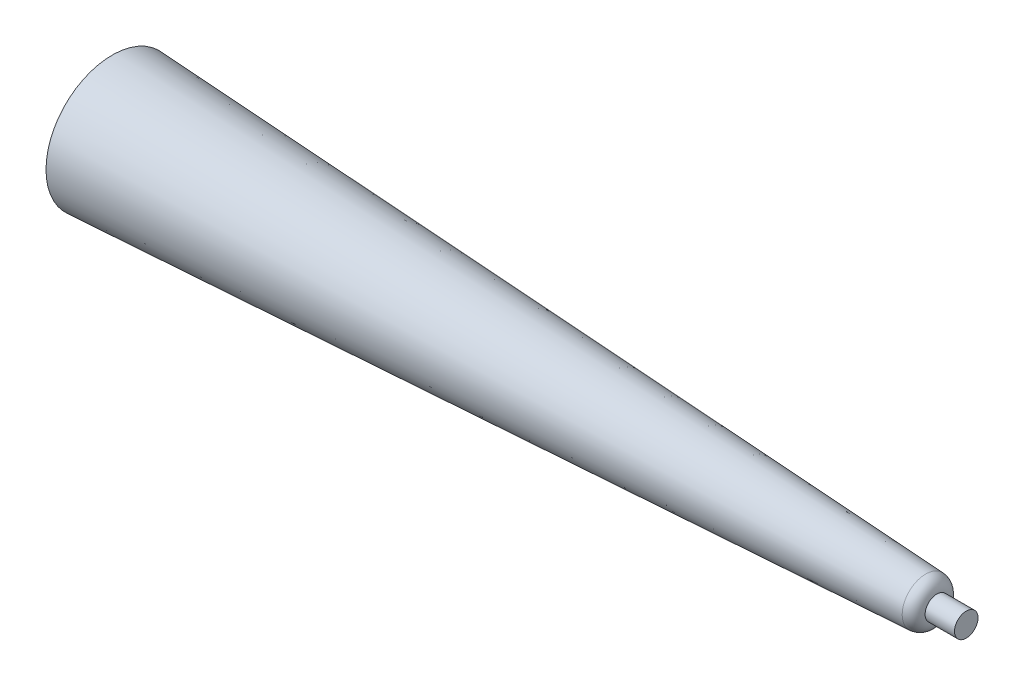
ISO-10303-21;
HEADER;
FILE_DESCRIPTION(('STEP AP214'),'2;1');
FILE_NAME('part.step','',(''),(''),'','','');
FILE_SCHEMA(('AUTOMOTIVE_DESIGN { 1 0 10303 214 1 1 1 1 }'));
ENDSEC;
DATA;
#1=APPLICATION_CONTEXT('core data for automotive mechanical design processes');
#2=APPLICATION_PROTOCOL_DEFINITION('international standard','automotive_design',2000,#1);
#3=PRODUCT_CONTEXT('',#1,'mechanical');
#4=PRODUCT('Part','Part','',(#3));
#5=PRODUCT_RELATED_PRODUCT_CATEGORY('part','',(#4));
#6=PRODUCT_DEFINITION_FORMATION('','',#4);
#7=PRODUCT_DEFINITION_CONTEXT('part definition',#1,'design');
#8=PRODUCT_DEFINITION('design','',#6,#7);
#9=PRODUCT_DEFINITION_SHAPE('','',#8);
#10=(LENGTH_UNIT() NAMED_UNIT(*) SI_UNIT(.MILLI.,.METRE.));
#11=(NAMED_UNIT(*) PLANE_ANGLE_UNIT() SI_UNIT($,.RADIAN.));
#12=(NAMED_UNIT(*) SI_UNIT($,.STERADIAN.) SOLID_ANGLE_UNIT());
#13=UNCERTAINTY_MEASURE_WITH_UNIT(LENGTH_MEASURE(1.E-05),#10,'distance_accuracy_value','');
#14=(GEOMETRIC_REPRESENTATION_CONTEXT(3) GLOBAL_UNCERTAINTY_ASSIGNED_CONTEXT((#13)) GLOBAL_UNIT_ASSIGNED_CONTEXT((#10,
#11,#12)) REPRESENTATION_CONTEXT('',''));
#15=CARTESIAN_POINT('',(0.,0.,0.));
#16=DIRECTION('',(0.,0.,1.));
#17=DIRECTION('',(1.,0.,0.));
#18=AXIS2_PLACEMENT_3D('',#15,#16,#17);
#19=CARTESIAN_POINT('',(-54.8672823597903,-3.28908892080457,0.));
#20=DIRECTION('',(1.,0.,0.));
#21=DIRECTION('',(0.,0.,-1.));
#22=AXIS2_PLACEMENT_3D('',#19,#20,#21);
#23=PLANE('',#22);
#24=CARTESIAN_POINT('',(-54.8672823597903,-6.14677677622485,0.));
#25=DIRECTION('',(-1.,0.,0.));
#26=DIRECTION('',(0.,0.,1.));
#27=AXIS2_PLACEMENT_3D('',#24,#25,#26);
#28=CIRCLE('',#27,2.85768785542028);
#29=CARTESIAN_POINT('',(-54.8672823597903,-6.14677677622485,2.85768785542028));
#30=VERTEX_POINT('',#29);
#31=EDGE_CURVE('E49',#30,#30,#28,.T.);
#32=ORIENTED_EDGE('',*,*,#31,.T.);
#33=EDGE_LOOP('',(#32));
#34=FACE_BOUND('',#33,.T.);
#35=ADVANCED_FACE('F35',(#34),#23,.F.);
#36=CARTESIAN_POINT('',(-17.9737106544911,-6.14677677622485,0.));
#37=DIRECTION('',(-1.,0.,0.));
#38=DIRECTION('',(0.,0.,1.));
#39=AXIS2_PLACEMENT_3D('',#36,#37,#38);
#40=PLANE('',#39);
#41=CARTESIAN_POINT('',(-17.9737106544911,-6.14677677622485,0.));
#42=DIRECTION('',(-1.,0.,0.));
#43=DIRECTION('',(0.,0.,1.));
#44=AXIS2_PLACEMENT_3D('',#41,#42,#43);
#45=CIRCLE('',#44,0.508);
#46=CARTESIAN_POINT('',(-17.9737106544911,-6.14677677622485,0.508));
#47=VERTEX_POINT('',#46);
#48=EDGE_CURVE('E10',#47,#47,#45,.T.);
#49=ORIENTED_EDGE('',*,*,#48,.F.);
#50=EDGE_LOOP('',(#49));
#51=FACE_BOUND('',#50,.T.);
#52=ADVANCED_FACE('F69',(#51),#40,.F.);
#53=CARTESIAN_POINT('',(-54.8672823597903,-6.14677677622485,0.));
#54=DIRECTION('',(-1.,0.,0.));
#55=DIRECTION('',(0.,0.,1.));
#56=AXIS2_PLACEMENT_3D('',#53,#54,#55);
#57=CYLINDRICAL_SURFACE('',#56,0.508);
#58=CARTESIAN_POINT('',(-19.2437106544911,-6.14677677622485,0.));
#59=DIRECTION('',(-1.,0.,0.));
#60=DIRECTION('',(0.,0.,1.));
#61=AXIS2_PLACEMENT_3D('',#58,#59,#60);
#62=CIRCLE('',#61,0.508);
#63=CARTESIAN_POINT('',(-19.2437106544911,-6.14677677622485,0.508));
#64=VERTEX_POINT('',#63);
#65=EDGE_CURVE('E41',#64,#64,#62,.T.);
#66=ORIENTED_EDGE('',*,*,#65,.F.);
#67=EDGE_LOOP('',(#66));
#68=FACE_BOUND('',#67,.T.);
#69=ORIENTED_EDGE('',*,*,#48,.T.);
#70=EDGE_LOOP('',(#69));
#71=FACE_BOUND('',#70,.T.);
#72=ADVANCED_FACE('F64',(#68,#71),#57,.T.);
#73=CARTESIAN_POINT('',(-19.752407806258,-6.14677677622485,0.));
#74=DIRECTION('',(-1.,0.,0.));
#75=DIRECTION('',(0.,0.,1.));
#76=AXIS2_PLACEMENT_3D('',#73,#74,#75);
#77=DEGENERATE_TOROIDAL_SURFACE('',#76,0.508,0.508697151766944,.T.);
#78=CARTESIAN_POINT('',(-19.7257846543822,-6.14677677622485,0.));
#79=DIRECTION('',(-1.,0.,0.));
#80=DIRECTION('',(0.,0.,1.));
#81=AXIS2_PLACEMENT_3D('',#78,#79,#80);
#82=CIRCLE('',#81,1.016);
#83=CARTESIAN_POINT('',(-19.7257846543822,-6.14677677622485,1.016));
#84=VERTEX_POINT('',#83);
#85=EDGE_CURVE('E45',#84,#84,#82,.T.);
#86=ORIENTED_EDGE('',*,*,#85,.F.);
#87=EDGE_LOOP('',(#86));
#88=FACE_BOUND('',#87,.T.);
#89=ORIENTED_EDGE('',*,*,#65,.T.);
#90=EDGE_LOOP('',(#89));
#91=FACE_BOUND('',#90,.T.);
#92=ADVANCED_FACE('F59',(#88,#91),#77,.T.);
#93=CARTESIAN_POINT('',(-19.7257846543822,-6.14677677622485,0.));
#94=DIRECTION('',(-1.,0.,0.));
#95=DIRECTION('',(0.,0.,1.));
#96=AXIS2_PLACEMENT_3D('',#93,#94,#95);
#97=CONICAL_SURFACE('',#96,1.016,0.0523598775598229);
#98=ORIENTED_EDGE('',*,*,#31,.F.);
#99=EDGE_LOOP('',(#98));
#100=FACE_BOUND('',#99,.T.);
#101=ORIENTED_EDGE('',*,*,#85,.T.);
#102=EDGE_LOOP('',(#101));
#103=FACE_BOUND('',#102,.T.);
#104=ADVANCED_FACE('F56',(#100,#103),#97,.T.);
#105=CLOSED_SHELL('',(#35,#52,#72,#92,#104));
#106=MANIFOLD_SOLID_BREP('B2',#105);
#107=ADVANCED_BREP_SHAPE_REPRESENTATION('',(#18,#106),#14);
#108=SHAPE_DEFINITION_REPRESENTATION(#9,#107);
ENDSEC;
END-ISO-10303-21;
